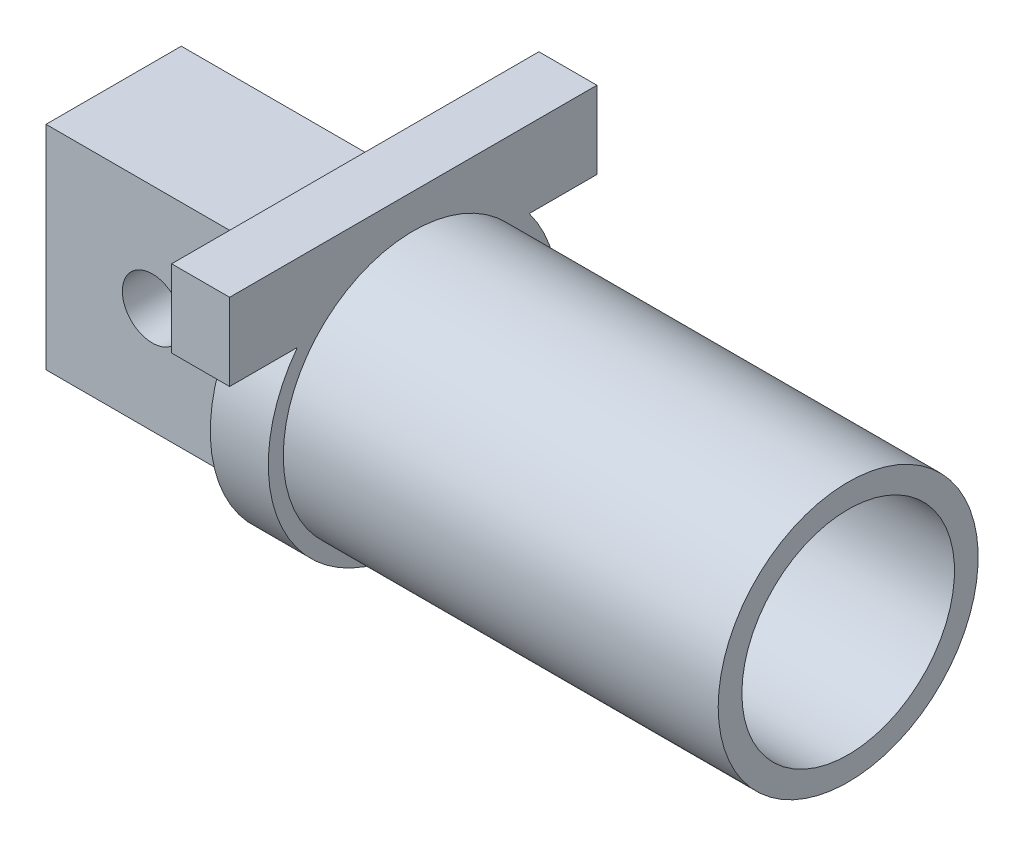
ISO-10303-21;
HEADER;
FILE_DESCRIPTION(('STEP AP214'),'2;1');
FILE_NAME('part.step','',(''),(''),'','','');
FILE_SCHEMA(('AUTOMOTIVE_DESIGN { 1 0 10303 214 1 1 1 1 }'));
ENDSEC;
DATA;
#1=APPLICATION_CONTEXT('core data for automotive mechanical design processes');
#2=APPLICATION_PROTOCOL_DEFINITION('international standard','automotive_design',2000,#1);
#3=PRODUCT_CONTEXT('',#1,'mechanical');
#4=PRODUCT('Part','Part','',(#3));
#5=PRODUCT_RELATED_PRODUCT_CATEGORY('part','',(#4));
#6=PRODUCT_DEFINITION_FORMATION('','',#4);
#7=PRODUCT_DEFINITION_CONTEXT('part definition',#1,'design');
#8=PRODUCT_DEFINITION('design','',#6,#7);
#9=PRODUCT_DEFINITION_SHAPE('','',#8);
#10=(LENGTH_UNIT() NAMED_UNIT(*) SI_UNIT(.MILLI.,.METRE.));
#11=(NAMED_UNIT(*) PLANE_ANGLE_UNIT() SI_UNIT($,.RADIAN.));
#12=(NAMED_UNIT(*) SI_UNIT($,.STERADIAN.) SOLID_ANGLE_UNIT());
#13=UNCERTAINTY_MEASURE_WITH_UNIT(LENGTH_MEASURE(1.E-05),#10,'distance_accuracy_value','');
#14=(GEOMETRIC_REPRESENTATION_CONTEXT(3) GLOBAL_UNCERTAINTY_ASSIGNED_CONTEXT((#13)) GLOBAL_UNIT_ASSIGNED_CONTEXT((#10,
#11,#12)) REPRESENTATION_CONTEXT('',''));
#15=CARTESIAN_POINT('',(0.,0.,0.));
#16=DIRECTION('',(0.,0.,1.));
#17=DIRECTION('',(1.,0.,0.));
#18=AXIS2_PLACEMENT_3D('',#15,#16,#17);
#19=CARTESIAN_POINT('',(-3000.,0.,0.));
#20=DIRECTION('',(-1.,0.,0.));
#21=DIRECTION('',(0.,0.,1.));
#22=AXIS2_PLACEMENT_3D('',#19,#20,#21);
#23=CYLINDRICAL_SURFACE('',#22,15.);
#24=DIRECTION('',(-1.,0.,0.));
#25=VECTOR('',#24,1.);
#26=CARTESIAN_POINT('',(-3000.,9.,-12.));
#27=LINE('',#26,#25);
#28=CARTESIAN_POINT('',(20.,9.,-12.));
#29=VERTEX_POINT('',#28);
#30=CARTESIAN_POINT('',(13.9999999999998,9.,-12.));
#31=VERTEX_POINT('',#30);
#32=EDGE_CURVE('E137',#29,#31,#27,.T.);
#33=ORIENTED_EDGE('',*,*,#32,.F.);
#34=CARTESIAN_POINT('',(20.,0.,0.));
#35=DIRECTION('',(-1.,0.,0.));
#36=DIRECTION('',(0.,0.,1.));
#37=AXIS2_PLACEMENT_3D('',#34,#35,#36);
#38=CIRCLE('',#37,15.);
#39=CARTESIAN_POINT('',(20.,9.,12.));
#40=VERTEX_POINT('',#39);
#41=EDGE_CURVE('E177',#29,#40,#38,.T.);
#42=ORIENTED_EDGE('',*,*,#41,.T.);
#43=DIRECTION('',(-1.,0.,0.));
#44=VECTOR('',#43,1.);
#45=CARTESIAN_POINT('',(-3000.,9.,12.));
#46=LINE('',#45,#44);
#47=CARTESIAN_POINT('',(13.9999999999998,9.,12.));
#48=VERTEX_POINT('',#47);
#49=EDGE_CURVE('E65',#48,#40,#46,.F.);
#50=ORIENTED_EDGE('',*,*,#49,.F.);
#51=CARTESIAN_POINT('',(13.9999999999998,0.,0.));
#52=DIRECTION('',(-1.,0.,0.));
#53=DIRECTION('',(0.,0.,1.));
#54=AXIS2_PLACEMENT_3D('',#51,#52,#53);
#55=CIRCLE('',#54,15.);
#56=EDGE_CURVE('E60',#31,#48,#55,.T.);
#57=ORIENTED_EDGE('',*,*,#56,.F.);
#58=EDGE_LOOP('',(#33,#42,#50,#57));
#59=FACE_BOUND('',#58,.T.);
#60=ADVANCED_FACE('F41',(#59),#23,.T.);
#61=CARTESIAN_POINT('',(14.,0.,0.));
#62=DIRECTION('',(1.,0.,0.));
#63=DIRECTION('',(0.,0.,-1.));
#64=AXIS2_PLACEMENT_3D('',#61,#62,#63);
#65=PLANE('',#64);
#66=DIRECTION('',(0.,-1.,0.));
#67=VECTOR('',#66,1.);
#68=CARTESIAN_POINT('',(14.,0.,7.));
#69=LINE('',#68,#67);
#70=CARTESIAN_POINT('',(14.,11.,7.));
#71=VERTEX_POINT('',#70);
#72=CARTESIAN_POINT('',(14.,-11.,7.));
#73=VERTEX_POINT('',#72);
#74=EDGE_CURVE('E11',#71,#73,#69,.T.);
#75=ORIENTED_EDGE('',*,*,#74,.T.);
#76=DIRECTION('',(0.,0.,1.));
#77=VECTOR('',#76,1.);
#78=CARTESIAN_POINT('',(14.,-11.,0.));
#79=LINE('',#78,#77);
#80=CARTESIAN_POINT('',(14.,-11.,-7.));
#81=VERTEX_POINT('',#80);
#82=EDGE_CURVE('E49',#81,#73,#79,.T.);
#83=ORIENTED_EDGE('',*,*,#82,.F.);
#84=DIRECTION('',(0.,-1.,0.));
#85=VECTOR('',#84,1.);
#86=CARTESIAN_POINT('',(14.,0.,-7.));
#87=LINE('',#86,#85);
#88=CARTESIAN_POINT('',(14.,11.,-7.));
#89=VERTEX_POINT('',#88);
#90=EDGE_CURVE('E181',#89,#81,#87,.T.);
#91=ORIENTED_EDGE('',*,*,#90,.F.);
#92=DIRECTION('',(0.,0.,-1.));
#93=VECTOR('',#92,1.);
#94=CARTESIAN_POINT('',(14.,11.,0.));
#95=LINE('',#94,#93);
#96=EDGE_CURVE('E183',#71,#89,#95,.T.);
#97=ORIENTED_EDGE('',*,*,#96,.F.);
#98=EDGE_LOOP('',(#75,#83,#91,#97));
#99=FACE_BOUND('',#98,.T.);
#100=ORIENTED_EDGE('',*,*,#56,.T.);
#101=DIRECTION('',(0.,0.,-1.));
#102=VECTOR('',#101,1.);
#103=CARTESIAN_POINT('',(14.,9.,19.));
#104=LINE('',#103,#102);
#105=CARTESIAN_POINT('',(14.,9.,19.));
#106=VERTEX_POINT('',#105);
#107=EDGE_CURVE('E117',#106,#48,#104,.T.);
#108=ORIENTED_EDGE('',*,*,#107,.F.);
#109=DIRECTION('',(0.,-1.,0.));
#110=VECTOR('',#109,1.);
#111=CARTESIAN_POINT('',(14.,17.,19.));
#112=LINE('',#111,#110);
#113=CARTESIAN_POINT('',(14.,17.,19.));
#114=VERTEX_POINT('',#113);
#115=EDGE_CURVE('E127',#114,#106,#112,.T.);
#116=ORIENTED_EDGE('',*,*,#115,.F.);
#117=DIRECTION('',(0.,0.,-1.));
#118=VECTOR('',#117,1.);
#119=CARTESIAN_POINT('',(14.,17.,19.));
#120=LINE('',#119,#118);
#121=CARTESIAN_POINT('',(14.,17.,-19.));
#122=VERTEX_POINT('',#121);
#123=EDGE_CURVE('E281',#114,#122,#120,.T.);
#124=ORIENTED_EDGE('',*,*,#123,.T.);
#125=DIRECTION('',(0.,-1.,0.));
#126=VECTOR('',#125,1.);
#127=CARTESIAN_POINT('',(14.,17.,-19.));
#128=LINE('',#127,#126);
#129=CARTESIAN_POINT('',(14.,9.,-19.));
#130=VERTEX_POINT('',#129);
#131=EDGE_CURVE('E277',#122,#130,#128,.T.);
#132=ORIENTED_EDGE('',*,*,#131,.T.);
#133=EDGE_CURVE('E136',#31,#130,#104,.T.);
#134=ORIENTED_EDGE('',*,*,#133,.F.);
#135=EDGE_LOOP('',(#100,#108,#116,#124,#132,#134));
#136=FACE_BOUND('',#135,.T.);
#137=ADVANCED_FACE('F43',(#99,#136),#65,.F.);
#138=CARTESIAN_POINT('',(20.,15.,0.));
#139=DIRECTION('',(-1.,0.,0.));
#140=DIRECTION('',(0.,0.,1.));
#141=AXIS2_PLACEMENT_3D('',#138,#139,#140);
#142=PLANE('',#141);
#143=CARTESIAN_POINT('',(20.,0.,0.));
#144=DIRECTION('',(-1.,0.,0.));
#145=DIRECTION('',(0.,0.,1.));
#146=AXIS2_PLACEMENT_3D('',#143,#144,#145);
#147=CIRCLE('',#146,13.45);
#148=CARTESIAN_POINT('',(20.,0.,13.45));
#149=VERTEX_POINT('',#148);
#150=EDGE_CURVE('E180',#149,#149,#147,.T.);
#151=ORIENTED_EDGE('',*,*,#150,.T.);
#152=EDGE_LOOP('',(#151));
#153=FACE_BOUND('',#152,.T.);
#154=ORIENTED_EDGE('',*,*,#41,.F.);
#155=DIRECTION('',(0.,0.,-1.));
#156=VECTOR('',#155,1.);
#157=CARTESIAN_POINT('',(20.,9.,19.));
#158=LINE('',#157,#156);
#159=CARTESIAN_POINT('',(20.,9.,-19.));
#160=VERTEX_POINT('',#159);
#161=EDGE_CURVE('E295',#29,#160,#158,.T.);
#162=ORIENTED_EDGE('',*,*,#161,.T.);
#163=DIRECTION('',(0.,1.,0.));
#164=VECTOR('',#163,1.);
#165=CARTESIAN_POINT('',(20.,9.,-19.));
#166=LINE('',#165,#164);
#167=CARTESIAN_POINT('',(20.,17.,-19.));
#168=VERTEX_POINT('',#167);
#169=EDGE_CURVE('E290',#160,#168,#166,.T.);
#170=ORIENTED_EDGE('',*,*,#169,.T.);
#171=DIRECTION('',(0.,0.,-1.));
#172=VECTOR('',#171,1.);
#173=CARTESIAN_POINT('',(20.,17.,19.));
#174=LINE('',#173,#172);
#175=CARTESIAN_POINT('',(20.,17.,19.));
#176=VERTEX_POINT('',#175);
#177=EDGE_CURVE('E287',#176,#168,#174,.T.);
#178=ORIENTED_EDGE('',*,*,#177,.F.);
#179=DIRECTION('',(0.,1.,0.));
#180=VECTOR('',#179,1.);
#181=CARTESIAN_POINT('',(20.,9.,19.));
#182=LINE('',#181,#180);
#183=CARTESIAN_POINT('',(20.,9.,19.));
#184=VERTEX_POINT('',#183);
#185=EDGE_CURVE('E122',#184,#176,#182,.T.);
#186=ORIENTED_EDGE('',*,*,#185,.F.);
#187=EDGE_CURVE('E125',#184,#40,#158,.T.);
#188=ORIENTED_EDGE('',*,*,#187,.T.);
#189=EDGE_LOOP('',(#154,#162,#170,#178,#186,#188));
#190=FACE_BOUND('',#189,.T.);
#191=ADVANCED_FACE('F221',(#153,#190),#142,.F.);
#192=CARTESIAN_POINT('',(-3000.,0.,0.));
#193=DIRECTION('',(-1.,0.,0.));
#194=DIRECTION('',(0.,0.,1.));
#195=AXIS2_PLACEMENT_3D('',#192,#193,#194);
#196=CYLINDRICAL_SURFACE('',#195,13.45);
#197=ORIENTED_EDGE('',*,*,#150,.F.);
#198=EDGE_LOOP('',(#197));
#199=FACE_BOUND('',#198,.T.);
#200=CARTESIAN_POINT('',(64.9999999999999,0.,0.));
#201=DIRECTION('',(-1.,0.,0.));
#202=DIRECTION('',(0.,0.,1.));
#203=AXIS2_PLACEMENT_3D('',#200,#201,#202);
#204=CIRCLE('',#203,13.45);
#205=CARTESIAN_POINT('',(64.9999999999999,0.,13.45));
#206=VERTEX_POINT('',#205);
#207=EDGE_CURVE('E174',#206,#206,#204,.T.);
#208=ORIENTED_EDGE('',*,*,#207,.T.);
#209=EDGE_LOOP('',(#208));
#210=FACE_BOUND('',#209,.T.);
#211=ADVANCED_FACE('F226',(#199,#210),#196,.T.);
#212=CARTESIAN_POINT('',(65.,13.45,0.));
#213=DIRECTION('',(-1.,0.,0.));
#214=DIRECTION('',(0.,0.,1.));
#215=AXIS2_PLACEMENT_3D('',#212,#213,#214);
#216=PLANE('',#215);
#217=ORIENTED_EDGE('',*,*,#207,.F.);
#218=EDGE_LOOP('',(#217));
#219=FACE_BOUND('',#218,.T.);
#220=CARTESIAN_POINT('',(64.9999999999999,0.,0.));
#221=DIRECTION('',(-1.,0.,0.));
#222=DIRECTION('',(0.,0.,1.));
#223=AXIS2_PLACEMENT_3D('',#220,#221,#222);
#224=CIRCLE('',#223,11.);
#225=CARTESIAN_POINT('',(64.9999999999999,0.,11.));
#226=VERTEX_POINT('',#225);
#227=EDGE_CURVE('E173',#226,#226,#224,.T.);
#228=ORIENTED_EDGE('',*,*,#227,.T.);
#229=EDGE_LOOP('',(#228));
#230=FACE_BOUND('',#229,.T.);
#231=ADVANCED_FACE('F235',(#219,#230),#216,.F.);
#232=CARTESIAN_POINT('',(-3000.,0.,0.));
#233=DIRECTION('',(-1.,0.,0.));
#234=DIRECTION('',(0.,0.,1.));
#235=AXIS2_PLACEMENT_3D('',#232,#233,#234);
#236=CYLINDRICAL_SURFACE('',#235,11.);
#237=ORIENTED_EDGE('',*,*,#227,.F.);
#238=EDGE_LOOP('',(#237));
#239=FACE_BOUND('',#238,.T.);
#240=CARTESIAN_POINT('',(29.9999999999998,0.,0.));
#241=DIRECTION('',(-1.,0.,0.));
#242=DIRECTION('',(0.,0.,1.));
#243=AXIS2_PLACEMENT_3D('',#240,#241,#242);
#244=CIRCLE('',#243,11.);
#245=CARTESIAN_POINT('',(29.9999999999998,0.,11.));
#246=VERTEX_POINT('',#245);
#247=EDGE_CURVE('E169',#246,#246,#244,.T.);
#248=ORIENTED_EDGE('',*,*,#247,.T.);
#249=EDGE_LOOP('',(#248));
#250=FACE_BOUND('',#249,.T.);
#251=ADVANCED_FACE('F237',(#239,#250),#236,.F.);
#252=CARTESIAN_POINT('',(30.,11.,0.));
#253=DIRECTION('',(-1.,0.,0.));
#254=DIRECTION('',(0.,0.,1.));
#255=AXIS2_PLACEMENT_3D('',#252,#253,#254);
#256=PLANE('',#255);
#257=ORIENTED_EDGE('',*,*,#247,.F.);
#258=EDGE_LOOP('',(#257));
#259=FACE_BOUND('',#258,.T.);
#260=ADVANCED_FACE('F220',(#259),#256,.F.);
#261=CARTESIAN_POINT('',(-11.,-11.,7.));
#262=DIRECTION('',(0.,1.,0.));
#263=DIRECTION('',(0.,0.,1.));
#264=AXIS2_PLACEMENT_3D('',#261,#262,#263);
#265=PLANE('',#264);
#266=DIRECTION('',(1.,0.,0.));
#267=VECTOR('',#266,1.);
#268=CARTESIAN_POINT('',(-11.,-11.,-7.));
#269=LINE('',#268,#267);
#270=CARTESIAN_POINT('',(-11.,-11.,-7.));
#271=VERTEX_POINT('',#270);
#272=EDGE_CURVE('E157',#271,#81,#269,.T.);
#273=ORIENTED_EDGE('',*,*,#272,.T.);
#274=ORIENTED_EDGE('',*,*,#82,.T.);
#275=DIRECTION('',(1.,0.,0.));
#276=VECTOR('',#275,1.);
#277=CARTESIAN_POINT('',(-11.,-11.,7.));
#278=LINE('',#277,#276);
#279=CARTESIAN_POINT('',(-11.,-11.,7.));
#280=VERTEX_POINT('',#279);
#281=EDGE_CURVE('E147',#280,#73,#278,.T.);
#282=ORIENTED_EDGE('',*,*,#281,.F.);
#283=DIRECTION('',(0.,0.,-1.));
#284=VECTOR('',#283,1.);
#285=CARTESIAN_POINT('',(-11.,-11.,7.));
#286=LINE('',#285,#284);
#287=EDGE_CURVE('E164',#280,#271,#286,.T.);
#288=ORIENTED_EDGE('',*,*,#287,.T.);
#289=EDGE_LOOP('',(#273,#274,#282,#288));
#290=FACE_BOUND('',#289,.T.);
#291=ADVANCED_FACE('F193',(#290),#265,.F.);
#292=CARTESIAN_POINT('',(16.,11.,7.));
#293=DIRECTION('',(0.,-1.,0.));
#294=DIRECTION('',(0.,0.,-1.));
#295=AXIS2_PLACEMENT_3D('',#292,#293,#294);
#296=PLANE('',#295);
#297=DIRECTION('',(-1.,0.,0.));
#298=VECTOR('',#297,1.);
#299=CARTESIAN_POINT('',(16.,11.,7.));
#300=LINE('',#299,#298);
#301=CARTESIAN_POINT('',(-11.,11.,7.));
#302=VERTEX_POINT('',#301);
#303=EDGE_CURVE('E152',#71,#302,#300,.T.);
#304=ORIENTED_EDGE('',*,*,#303,.F.);
#305=ORIENTED_EDGE('',*,*,#96,.T.);
#306=DIRECTION('',(-1.,0.,0.));
#307=VECTOR('',#306,1.);
#308=CARTESIAN_POINT('',(16.,11.,-7.));
#309=LINE('',#308,#307);
#310=CARTESIAN_POINT('',(-11.,11.,-7.));
#311=VERTEX_POINT('',#310);
#312=EDGE_CURVE('E151',#89,#311,#309,.T.);
#313=ORIENTED_EDGE('',*,*,#312,.T.);
#314=DIRECTION('',(0.,0.,-1.));
#315=VECTOR('',#314,1.);
#316=CARTESIAN_POINT('',(-11.,11.,7.));
#317=LINE('',#316,#315);
#318=EDGE_CURVE('E156',#302,#311,#317,.T.);
#319=ORIENTED_EDGE('',*,*,#318,.F.);
#320=EDGE_LOOP('',(#304,#305,#313,#319));
#321=FACE_BOUND('',#320,.T.);
#322=ADVANCED_FACE('F210',(#321),#296,.F.);
#323=CARTESIAN_POINT('',(0.,0.,7.));
#324=DIRECTION('',(0.,0.,1.));
#325=DIRECTION('',(1.,0.,0.));
#326=AXIS2_PLACEMENT_3D('',#323,#324,#325);
#327=PLANE('',#326);
#328=CARTESIAN_POINT('',(0.,0.,7.));
#329=DIRECTION('',(0.,0.,1.));
#330=DIRECTION('',(1.,0.,0.));
#331=AXIS2_PLACEMENT_3D('',#328,#329,#330);
#332=CIRCLE('',#331,3.1);
#333=CARTESIAN_POINT('',(3.1,0.,7.));
#334=VERTEX_POINT('',#333);
#335=EDGE_CURVE('E273',#334,#334,#332,.T.);
#336=ORIENTED_EDGE('',*,*,#335,.F.);
#337=EDGE_LOOP('',(#336));
#338=FACE_BOUND('',#337,.T.);
#339=ORIENTED_EDGE('',*,*,#74,.F.);
#340=ORIENTED_EDGE('',*,*,#303,.T.);
#341=DIRECTION('',(0.,-1.,0.));
#342=VECTOR('',#341,1.);
#343=CARTESIAN_POINT('',(-11.,11.,7.));
#344=LINE('',#343,#342);
#345=EDGE_CURVE('E150',#302,#280,#344,.T.);
#346=ORIENTED_EDGE('',*,*,#345,.T.);
#347=ORIENTED_EDGE('',*,*,#281,.T.);
#348=EDGE_LOOP('',(#339,#340,#346,#347));
#349=FACE_BOUND('',#348,.T.);
#350=ADVANCED_FACE('F192',(#338,#349),#327,.T.);
#351=CARTESIAN_POINT('',(0.,0.,-7.));
#352=DIRECTION('',(0.,0.,1.));
#353=DIRECTION('',(1.,0.,0.));
#354=AXIS2_PLACEMENT_3D('',#351,#352,#353);
#355=PLANE('',#354);
#356=CARTESIAN_POINT('',(0.,0.,-7.));
#357=DIRECTION('',(0.,0.,1.));
#358=DIRECTION('',(1.,0.,0.));
#359=AXIS2_PLACEMENT_3D('',#356,#357,#358);
#360=CIRCLE('',#359,3.1);
#361=CARTESIAN_POINT('',(3.1,0.,-7.));
#362=VERTEX_POINT('',#361);
#363=EDGE_CURVE('E44',#362,#362,#360,.T.);
#364=ORIENTED_EDGE('',*,*,#363,.T.);
#365=EDGE_LOOP('',(#364));
#366=FACE_BOUND('',#365,.T.);
#367=ORIENTED_EDGE('',*,*,#312,.F.);
#368=ORIENTED_EDGE('',*,*,#90,.T.);
#369=ORIENTED_EDGE('',*,*,#272,.F.);
#370=DIRECTION('',(0.,-1.,0.));
#371=VECTOR('',#370,1.);
#372=CARTESIAN_POINT('',(-11.,11.,-7.));
#373=LINE('',#372,#371);
#374=EDGE_CURVE('E148',#311,#271,#373,.T.);
#375=ORIENTED_EDGE('',*,*,#374,.F.);
#376=EDGE_LOOP('',(#367,#368,#369,#375));
#377=FACE_BOUND('',#376,.T.);
#378=ADVANCED_FACE('F202',(#366,#377),#355,.F.);
#379=CARTESIAN_POINT('',(-11.,11.,7.));
#380=DIRECTION('',(1.,0.,0.));
#381=DIRECTION('',(0.,0.,-1.));
#382=AXIS2_PLACEMENT_3D('',#379,#380,#381);
#383=PLANE('',#382);
#384=ORIENTED_EDGE('',*,*,#374,.T.);
#385=ORIENTED_EDGE('',*,*,#287,.F.);
#386=ORIENTED_EDGE('',*,*,#345,.F.);
#387=ORIENTED_EDGE('',*,*,#318,.T.);
#388=EDGE_LOOP('',(#384,#385,#386,#387));
#389=FACE_BOUND('',#388,.T.);
#390=ADVANCED_FACE('F203',(#389),#383,.F.);
#391=CARTESIAN_POINT('',(14.,9.,19.));
#392=DIRECTION('',(0.,1.,0.));
#393=DIRECTION('',(0.,0.,1.));
#394=AXIS2_PLACEMENT_3D('',#391,#392,#393);
#395=PLANE('',#394);
#396=ORIENTED_EDGE('',*,*,#161,.F.);
#397=ORIENTED_EDGE('',*,*,#32,.T.);
#398=ORIENTED_EDGE('',*,*,#133,.T.);
#399=DIRECTION('',(1.,0.,0.));
#400=VECTOR('',#399,1.);
#401=CARTESIAN_POINT('',(14.,9.,-19.));
#402=LINE('',#401,#400);
#403=EDGE_CURVE('E276',#130,#160,#402,.T.);
#404=ORIENTED_EDGE('',*,*,#403,.T.);
#405=EDGE_LOOP('',(#396,#397,#398,#404));
#406=FACE_BOUND('',#405,.T.);
#407=ADVANCED_FACE('F244',(#406),#395,.F.);
#408=ORIENTED_EDGE('',*,*,#107,.T.);
#409=ORIENTED_EDGE('',*,*,#49,.T.);
#410=ORIENTED_EDGE('',*,*,#187,.F.);
#411=DIRECTION('',(1.,0.,0.));
#412=VECTOR('',#411,1.);
#413=CARTESIAN_POINT('',(14.,9.,19.));
#414=LINE('',#413,#412);
#415=EDGE_CURVE('E118',#106,#184,#414,.T.);
#416=ORIENTED_EDGE('',*,*,#415,.F.);
#417=EDGE_LOOP('',(#408,#409,#410,#416));
#418=FACE_BOUND('',#417,.T.);
#419=ADVANCED_FACE('F116',(#418),#395,.F.);
#420=CARTESIAN_POINT('',(20.,17.,19.));
#421=DIRECTION('',(0.,-1.,0.));
#422=DIRECTION('',(0.,0.,-1.));
#423=AXIS2_PLACEMENT_3D('',#420,#421,#422);
#424=PLANE('',#423);
#425=DIRECTION('',(-1.,0.,0.));
#426=VECTOR('',#425,1.);
#427=CARTESIAN_POINT('',(20.,17.,-19.));
#428=LINE('',#427,#426);
#429=EDGE_CURVE('E132',#168,#122,#428,.T.);
#430=ORIENTED_EDGE('',*,*,#429,.T.);
#431=ORIENTED_EDGE('',*,*,#123,.F.);
#432=DIRECTION('',(-1.,0.,0.));
#433=VECTOR('',#432,1.);
#434=CARTESIAN_POINT('',(20.,17.,19.));
#435=LINE('',#434,#433);
#436=EDGE_CURVE('E133',#176,#114,#435,.T.);
#437=ORIENTED_EDGE('',*,*,#436,.F.);
#438=ORIENTED_EDGE('',*,*,#177,.T.);
#439=EDGE_LOOP('',(#430,#431,#437,#438));
#440=FACE_BOUND('',#439,.T.);
#441=ADVANCED_FACE('F260',(#440),#424,.F.);
#442=CARTESIAN_POINT('',(0.,0.,19.));
#443=DIRECTION('',(0.,0.,1.));
#444=DIRECTION('',(1.,0.,0.));
#445=AXIS2_PLACEMENT_3D('',#442,#443,#444);
#446=PLANE('',#445);
#447=ORIENTED_EDGE('',*,*,#115,.T.);
#448=ORIENTED_EDGE('',*,*,#415,.T.);
#449=ORIENTED_EDGE('',*,*,#185,.T.);
#450=ORIENTED_EDGE('',*,*,#436,.T.);
#451=EDGE_LOOP('',(#447,#448,#449,#450));
#452=FACE_BOUND('',#451,.T.);
#453=ADVANCED_FACE('F129',(#452),#446,.T.);
#454=CARTESIAN_POINT('',(0.,0.,-19.));
#455=DIRECTION('',(0.,0.,1.));
#456=DIRECTION('',(1.,0.,0.));
#457=AXIS2_PLACEMENT_3D('',#454,#455,#456);
#458=PLANE('',#457);
#459=ORIENTED_EDGE('',*,*,#131,.F.);
#460=ORIENTED_EDGE('',*,*,#429,.F.);
#461=ORIENTED_EDGE('',*,*,#169,.F.);
#462=ORIENTED_EDGE('',*,*,#403,.F.);
#463=EDGE_LOOP('',(#459,#460,#461,#462));
#464=FACE_BOUND('',#463,.T.);
#465=ADVANCED_FACE('F261',(#464),#458,.F.);
#466=CARTESIAN_POINT('',(0.,0.,-10.));
#467=DIRECTION('',(0.,0.,1.));
#468=DIRECTION('',(1.,0.,0.));
#469=AXIS2_PLACEMENT_3D('',#466,#467,#468);
#470=CYLINDRICAL_SURFACE('',#469,3.1);
#471=ORIENTED_EDGE('',*,*,#335,.T.);
#472=EDGE_LOOP('',(#471));
#473=FACE_BOUND('',#472,.T.);
#474=ORIENTED_EDGE('',*,*,#363,.F.);
#475=EDGE_LOOP('',(#474));
#476=FACE_BOUND('',#475,.T.);
#477=ADVANCED_FACE('F262',(#473,#476),#470,.F.);
#478=CLOSED_SHELL('',(#60,#137,#191,#211,#231,#251,#260,#291,#322,#350,#378,#390,#407,#419,#441,
#453,#465,#477));
#479=MANIFOLD_SOLID_BREP('B2',#478);
#480=ADVANCED_BREP_SHAPE_REPRESENTATION('',(#18,#479),#14);
#481=SHAPE_DEFINITION_REPRESENTATION(#9,#480);
ENDSEC;
END-ISO-10303-21;
